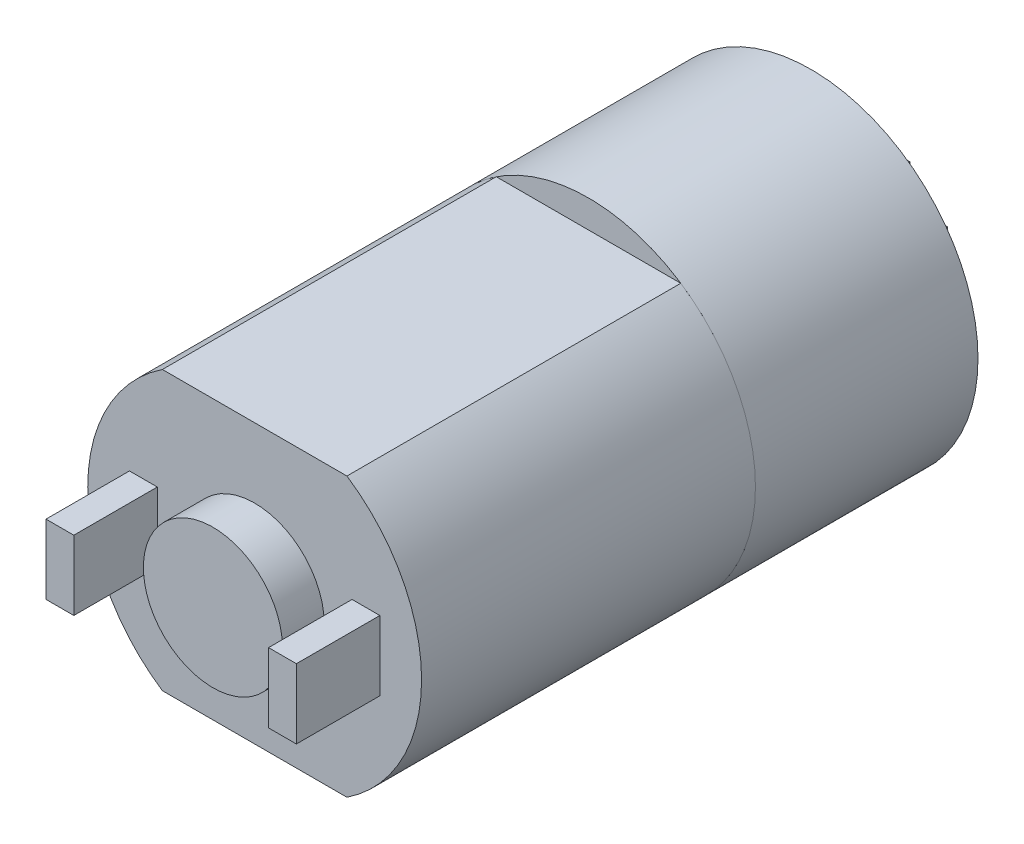
ISO-10303-21;
HEADER;
FILE_DESCRIPTION(('STEP AP214'),'2;1');
FILE_NAME('part.step','',(''),(''),'','','');
FILE_SCHEMA(('AUTOMOTIVE_DESIGN { 1 0 10303 214 1 1 1 1 }'));
ENDSEC;
DATA;
#1=APPLICATION_CONTEXT('core data for automotive mechanical design processes');
#2=APPLICATION_PROTOCOL_DEFINITION('international standard','automotive_design',2000,#1);
#3=PRODUCT_CONTEXT('',#1,'mechanical');
#4=PRODUCT('Part','Part','',(#3));
#5=PRODUCT_RELATED_PRODUCT_CATEGORY('part','',(#4));
#6=PRODUCT_DEFINITION_FORMATION('','',#4);
#7=PRODUCT_DEFINITION_CONTEXT('part definition',#1,'design');
#8=PRODUCT_DEFINITION('design','',#6,#7);
#9=PRODUCT_DEFINITION_SHAPE('','',#8);
#10=(LENGTH_UNIT() NAMED_UNIT(*) SI_UNIT(.MILLI.,.METRE.));
#11=(NAMED_UNIT(*) PLANE_ANGLE_UNIT() SI_UNIT($,.RADIAN.));
#12=(NAMED_UNIT(*) SI_UNIT($,.STERADIAN.) SOLID_ANGLE_UNIT());
#13=UNCERTAINTY_MEASURE_WITH_UNIT(LENGTH_MEASURE(1.E-05),#10,'distance_accuracy_value','');
#14=(GEOMETRIC_REPRESENTATION_CONTEXT(3) GLOBAL_UNCERTAINTY_ASSIGNED_CONTEXT((#13)) GLOBAL_UNIT_ASSIGNED_CONTEXT((#10,
#11,#12)) REPRESENTATION_CONTEXT('',''));
#15=CARTESIAN_POINT('',(0.,0.,0.));
#16=DIRECTION('',(0.,0.,1.));
#17=DIRECTION('',(1.,0.,0.));
#18=AXIS2_PLACEMENT_3D('',#15,#16,#17);
#19=CARTESIAN_POINT('',(4.5,1.25,23.));
#20=DIRECTION('',(-1.,0.,0.));
#21=DIRECTION('',(0.,0.,1.));
#22=AXIS2_PLACEMENT_3D('',#19,#20,#21);
#23=PLANE('',#22);
#24=DIRECTION('',(0.,1.,0.));
#25=VECTOR('',#24,1.);
#26=CARTESIAN_POINT('',(4.5,1.25,20.));
#27=LINE('',#26,#25);
#28=CARTESIAN_POINT('',(4.5,-1.25,20.));
#29=VERTEX_POINT('',#28);
#30=CARTESIAN_POINT('',(4.5,1.25,20.));
#31=VERTEX_POINT('',#30);
#32=EDGE_CURVE('E115',#29,#31,#27,.T.);
#33=ORIENTED_EDGE('',*,*,#32,.T.);
#34=DIRECTION('',(0.,0.,-1.));
#35=VECTOR('',#34,1.);
#36=CARTESIAN_POINT('',(4.5,1.25,23.));
#37=LINE('',#36,#35);
#38=CARTESIAN_POINT('',(4.5,1.25,23.));
#39=VERTEX_POINT('',#38);
#40=EDGE_CURVE('E12',#39,#31,#37,.T.);
#41=ORIENTED_EDGE('',*,*,#40,.F.);
#42=DIRECTION('',(0.,1.,0.));
#43=VECTOR('',#42,1.);
#44=CARTESIAN_POINT('',(4.5,1.25,23.));
#45=LINE('',#44,#43);
#46=CARTESIAN_POINT('',(4.5,-1.25,23.));
#47=VERTEX_POINT('',#46);
#48=EDGE_CURVE('E103',#47,#39,#45,.T.);
#49=ORIENTED_EDGE('',*,*,#48,.F.);
#50=DIRECTION('',(0.,0.,-1.));
#51=VECTOR('',#50,1.);
#52=CARTESIAN_POINT('',(4.5,-1.25,23.));
#53=LINE('',#52,#51);
#54=EDGE_CURVE('E111',#47,#29,#53,.T.);
#55=ORIENTED_EDGE('',*,*,#54,.T.);
#56=EDGE_LOOP('',(#33,#41,#49,#55));
#57=FACE_BOUND('',#56,.T.);
#58=ADVANCED_FACE('F52',(#57),#23,.F.);
#59=CARTESIAN_POINT('',(4.5,1.25,23.));
#60=DIRECTION('',(0.,-1.,0.));
#61=DIRECTION('',(1.,0.,0.));
#62=AXIS2_PLACEMENT_3D('',#59,#60,#61);
#63=PLANE('',#62);
#64=DIRECTION('',(-1.,0.,0.));
#65=VECTOR('',#64,1.);
#66=CARTESIAN_POINT('',(4.5,1.25,20.));
#67=LINE('',#66,#65);
#68=CARTESIAN_POINT('',(3.5,1.25,20.));
#69=VERTEX_POINT('',#68);
#70=EDGE_CURVE('E107',#31,#69,#67,.T.);
#71=ORIENTED_EDGE('',*,*,#70,.T.);
#72=DIRECTION('',(0.,0.,-1.));
#73=VECTOR('',#72,1.);
#74=CARTESIAN_POINT('',(3.5,1.25,23.));
#75=LINE('',#74,#73);
#76=CARTESIAN_POINT('',(3.5,1.25,23.));
#77=VERTEX_POINT('',#76);
#78=EDGE_CURVE('E60',#77,#69,#75,.T.);
#79=ORIENTED_EDGE('',*,*,#78,.F.);
#80=DIRECTION('',(-1.,0.,0.));
#81=VECTOR('',#80,1.);
#82=CARTESIAN_POINT('',(4.5,1.25,23.));
#83=LINE('',#82,#81);
#84=EDGE_CURVE('E98',#39,#77,#83,.T.);
#85=ORIENTED_EDGE('',*,*,#84,.F.);
#86=ORIENTED_EDGE('',*,*,#40,.T.);
#87=EDGE_LOOP('',(#71,#79,#85,#86));
#88=FACE_BOUND('',#87,.T.);
#89=ADVANCED_FACE('F106',(#88),#63,.F.);
#90=CARTESIAN_POINT('',(3.5,1.25,23.));
#91=DIRECTION('',(1.,0.,0.));
#92=DIRECTION('',(0.,1.,0.));
#93=AXIS2_PLACEMENT_3D('',#90,#91,#92);
#94=PLANE('',#93);
#95=DIRECTION('',(0.,-1.,0.));
#96=VECTOR('',#95,1.);
#97=CARTESIAN_POINT('',(3.5,1.25,20.));
#98=LINE('',#97,#96);
#99=CARTESIAN_POINT('',(3.5,-1.25,20.));
#100=VERTEX_POINT('',#99);
#101=EDGE_CURVE('E85',#69,#100,#98,.T.);
#102=ORIENTED_EDGE('',*,*,#101,.T.);
#103=DIRECTION('',(0.,0.,-1.));
#104=VECTOR('',#103,1.);
#105=CARTESIAN_POINT('',(3.5,-1.25,23.));
#106=LINE('',#105,#104);
#107=CARTESIAN_POINT('',(3.5,-1.25,23.));
#108=VERTEX_POINT('',#107);
#109=EDGE_CURVE('E108',#108,#100,#106,.T.);
#110=ORIENTED_EDGE('',*,*,#109,.F.);
#111=DIRECTION('',(0.,-1.,0.));
#112=VECTOR('',#111,1.);
#113=CARTESIAN_POINT('',(3.5,1.25,23.));
#114=LINE('',#113,#112);
#115=EDGE_CURVE('E101',#77,#108,#114,.T.);
#116=ORIENTED_EDGE('',*,*,#115,.F.);
#117=ORIENTED_EDGE('',*,*,#78,.T.);
#118=EDGE_LOOP('',(#102,#110,#116,#117));
#119=FACE_BOUND('',#118,.T.);
#120=ADVANCED_FACE('F109',(#119),#94,.F.);
#121=CARTESIAN_POINT('',(4.5,-1.25,23.));
#122=DIRECTION('',(0.,1.,0.));
#123=DIRECTION('',(0.,0.,1.));
#124=AXIS2_PLACEMENT_3D('',#121,#122,#123);
#125=PLANE('',#124);
#126=DIRECTION('',(1.,0.,0.));
#127=VECTOR('',#126,1.);
#128=CARTESIAN_POINT('',(4.5,-1.25,20.));
#129=LINE('',#128,#127);
#130=EDGE_CURVE('E91',#100,#29,#129,.T.);
#131=ORIENTED_EDGE('',*,*,#130,.T.);
#132=ORIENTED_EDGE('',*,*,#54,.F.);
#133=DIRECTION('',(1.,0.,0.));
#134=VECTOR('',#133,1.);
#135=CARTESIAN_POINT('',(4.5,-1.25,23.));
#136=LINE('',#135,#134);
#137=EDGE_CURVE('E68',#108,#47,#136,.T.);
#138=ORIENTED_EDGE('',*,*,#137,.F.);
#139=ORIENTED_EDGE('',*,*,#109,.T.);
#140=EDGE_LOOP('',(#131,#132,#138,#139));
#141=FACE_BOUND('',#140,.T.);
#142=ADVANCED_FACE('F122',(#141),#125,.F.);
#143=CARTESIAN_POINT('',(0.,0.,23.));
#144=DIRECTION('',(0.,0.,-1.));
#145=DIRECTION('',(-1.,0.,0.));
#146=AXIS2_PLACEMENT_3D('',#143,#144,#145);
#147=PLANE('',#146);
#148=ORIENTED_EDGE('',*,*,#48,.T.);
#149=ORIENTED_EDGE('',*,*,#84,.T.);
#150=ORIENTED_EDGE('',*,*,#115,.T.);
#151=ORIENTED_EDGE('',*,*,#137,.T.);
#152=EDGE_LOOP('',(#148,#149,#150,#151));
#153=FACE_BOUND('',#152,.T.);
#154=ADVANCED_FACE('F99',(#153),#147,.F.);
#155=CARTESIAN_POINT('',(0.,0.,20.));
#156=DIRECTION('',(0.,0.,-1.));
#157=DIRECTION('',(-1.,0.,0.));
#158=AXIS2_PLACEMENT_3D('',#155,#156,#157);
#159=PLANE('',#158);
#160=ORIENTED_EDGE('',*,*,#32,.F.);
#161=ORIENTED_EDGE('',*,*,#130,.F.);
#162=ORIENTED_EDGE('',*,*,#101,.F.);
#163=ORIENTED_EDGE('',*,*,#70,.F.);
#164=EDGE_LOOP('',(#160,#161,#162,#163));
#165=FACE_BOUND('',#164,.T.);
#166=ADVANCED_FACE('F125',(#165),#159,.T.);
#167=CLOSED_SHELL('',(#58,#89,#120,#142,#154,#166));
#168=MANIFOLD_SOLID_BREP('B2',#167);
#169=CARTESIAN_POINT('',(-3.5,1.25,23.));
#170=DIRECTION('',(-1.,0.,0.));
#171=DIRECTION('',(0.,-1.,0.));
#172=AXIS2_PLACEMENT_3D('',#169,#170,#171);
#173=PLANE('',#172);
#174=DIRECTION('',(0.,1.,0.));
#175=VECTOR('',#174,1.);
#176=CARTESIAN_POINT('',(-3.5,1.25,20.));
#177=LINE('',#176,#175);
#178=CARTESIAN_POINT('',(-3.5,-1.25,20.));
#179=VERTEX_POINT('',#178);
#180=CARTESIAN_POINT('',(-3.5,1.25,20.));
#181=VERTEX_POINT('',#180);
#182=EDGE_CURVE('E237',#179,#181,#177,.T.);
#183=ORIENTED_EDGE('',*,*,#182,.T.);
#184=DIRECTION('',(0.,0.,-1.));
#185=VECTOR('',#184,1.);
#186=CARTESIAN_POINT('',(-3.5,1.25,23.));
#187=LINE('',#186,#185);
#188=CARTESIAN_POINT('',(-3.5,1.25,23.));
#189=VERTEX_POINT('',#188);
#190=EDGE_CURVE('E50',#189,#181,#187,.T.);
#191=ORIENTED_EDGE('',*,*,#190,.F.);
#192=DIRECTION('',(0.,1.,0.));
#193=VECTOR('',#192,1.);
#194=CARTESIAN_POINT('',(-3.5,1.25,23.));
#195=LINE('',#194,#193);
#196=CARTESIAN_POINT('',(-3.5,-1.25,23.));
#197=VERTEX_POINT('',#196);
#198=EDGE_CURVE('E225',#197,#189,#195,.T.);
#199=ORIENTED_EDGE('',*,*,#198,.F.);
#200=DIRECTION('',(0.,0.,-1.));
#201=VECTOR('',#200,1.);
#202=CARTESIAN_POINT('',(-3.5,-1.25,23.));
#203=LINE('',#202,#201);
#204=EDGE_CURVE('E233',#197,#179,#203,.T.);
#205=ORIENTED_EDGE('',*,*,#204,.T.);
#206=EDGE_LOOP('',(#183,#191,#199,#205));
#207=FACE_BOUND('',#206,.T.);
#208=ADVANCED_FACE('F174',(#207),#173,.F.);
#209=CARTESIAN_POINT('',(-4.5,1.25,23.));
#210=DIRECTION('',(0.,-1.,0.));
#211=DIRECTION('',(1.,0.,0.));
#212=AXIS2_PLACEMENT_3D('',#209,#210,#211);
#213=PLANE('',#212);
#214=DIRECTION('',(-1.,0.,0.));
#215=VECTOR('',#214,1.);
#216=CARTESIAN_POINT('',(-4.5,1.25,20.));
#217=LINE('',#216,#215);
#218=CARTESIAN_POINT('',(-4.5,1.25,20.));
#219=VERTEX_POINT('',#218);
#220=EDGE_CURVE('E229',#181,#219,#217,.T.);
#221=ORIENTED_EDGE('',*,*,#220,.T.);
#222=DIRECTION('',(0.,0.,-1.));
#223=VECTOR('',#222,1.);
#224=CARTESIAN_POINT('',(-4.5,1.25,23.));
#225=LINE('',#224,#223);
#226=CARTESIAN_POINT('',(-4.5,1.25,23.));
#227=VERTEX_POINT('',#226);
#228=EDGE_CURVE('E182',#227,#219,#225,.T.);
#229=ORIENTED_EDGE('',*,*,#228,.F.);
#230=DIRECTION('',(-1.,0.,0.));
#231=VECTOR('',#230,1.);
#232=CARTESIAN_POINT('',(-4.5,1.25,23.));
#233=LINE('',#232,#231);
#234=EDGE_CURVE('E220',#189,#227,#233,.T.);
#235=ORIENTED_EDGE('',*,*,#234,.F.);
#236=ORIENTED_EDGE('',*,*,#190,.T.);
#237=EDGE_LOOP('',(#221,#229,#235,#236));
#238=FACE_BOUND('',#237,.T.);
#239=ADVANCED_FACE('F228',(#238),#213,.F.);
#240=CARTESIAN_POINT('',(-4.5,1.25,23.));
#241=DIRECTION('',(1.,0.,0.));
#242=DIRECTION('',(0.,0.,-1.));
#243=AXIS2_PLACEMENT_3D('',#240,#241,#242);
#244=PLANE('',#243);
#245=DIRECTION('',(0.,-1.,0.));
#246=VECTOR('',#245,1.);
#247=CARTESIAN_POINT('',(-4.5,1.25,20.));
#248=LINE('',#247,#246);
#249=CARTESIAN_POINT('',(-4.5,-1.25,20.));
#250=VERTEX_POINT('',#249);
#251=EDGE_CURVE('E207',#219,#250,#248,.T.);
#252=ORIENTED_EDGE('',*,*,#251,.T.);
#253=DIRECTION('',(0.,0.,-1.));
#254=VECTOR('',#253,1.);
#255=CARTESIAN_POINT('',(-4.5,-1.25,23.));
#256=LINE('',#255,#254);
#257=CARTESIAN_POINT('',(-4.5,-1.25,23.));
#258=VERTEX_POINT('',#257);
#259=EDGE_CURVE('E230',#258,#250,#256,.T.);
#260=ORIENTED_EDGE('',*,*,#259,.F.);
#261=DIRECTION('',(0.,-1.,0.));
#262=VECTOR('',#261,1.);
#263=CARTESIAN_POINT('',(-4.5,1.25,23.));
#264=LINE('',#263,#262);
#265=EDGE_CURVE('E223',#227,#258,#264,.T.);
#266=ORIENTED_EDGE('',*,*,#265,.F.);
#267=ORIENTED_EDGE('',*,*,#228,.T.);
#268=EDGE_LOOP('',(#252,#260,#266,#267));
#269=FACE_BOUND('',#268,.T.);
#270=ADVANCED_FACE('F231',(#269),#244,.F.);
#271=CARTESIAN_POINT('',(-4.5,-1.25,23.));
#272=DIRECTION('',(0.,1.,0.));
#273=DIRECTION('',(0.,0.,1.));
#274=AXIS2_PLACEMENT_3D('',#271,#272,#273);
#275=PLANE('',#274);
#276=DIRECTION('',(1.,0.,0.));
#277=VECTOR('',#276,1.);
#278=CARTESIAN_POINT('',(-4.5,-1.25,20.));
#279=LINE('',#278,#277);
#280=EDGE_CURVE('E213',#250,#179,#279,.T.);
#281=ORIENTED_EDGE('',*,*,#280,.T.);
#282=ORIENTED_EDGE('',*,*,#204,.F.);
#283=DIRECTION('',(1.,0.,0.));
#284=VECTOR('',#283,1.);
#285=CARTESIAN_POINT('',(-4.5,-1.25,23.));
#286=LINE('',#285,#284);
#287=EDGE_CURVE('E190',#258,#197,#286,.T.);
#288=ORIENTED_EDGE('',*,*,#287,.F.);
#289=ORIENTED_EDGE('',*,*,#259,.T.);
#290=EDGE_LOOP('',(#281,#282,#288,#289));
#291=FACE_BOUND('',#290,.T.);
#292=ADVANCED_FACE('F244',(#291),#275,.F.);
#293=CARTESIAN_POINT('',(0.,0.,23.));
#294=DIRECTION('',(0.,0.,1.));
#295=DIRECTION('',(1.,0.,0.));
#296=AXIS2_PLACEMENT_3D('',#293,#294,#295);
#297=PLANE('',#296);
#298=ORIENTED_EDGE('',*,*,#198,.T.);
#299=ORIENTED_EDGE('',*,*,#234,.T.);
#300=ORIENTED_EDGE('',*,*,#265,.T.);
#301=ORIENTED_EDGE('',*,*,#287,.T.);
#302=EDGE_LOOP('',(#298,#299,#300,#301));
#303=FACE_BOUND('',#302,.T.);
#304=ADVANCED_FACE('F221',(#303),#297,.T.);
#305=CARTESIAN_POINT('',(0.,0.,20.));
#306=DIRECTION('',(0.,0.,1.));
#307=DIRECTION('',(1.,0.,0.));
#308=AXIS2_PLACEMENT_3D('',#305,#306,#307);
#309=PLANE('',#308);
#310=ORIENTED_EDGE('',*,*,#182,.F.);
#311=ORIENTED_EDGE('',*,*,#280,.F.);
#312=ORIENTED_EDGE('',*,*,#251,.F.);
#313=ORIENTED_EDGE('',*,*,#220,.F.);
#314=EDGE_LOOP('',(#310,#311,#312,#313));
#315=FACE_BOUND('',#314,.T.);
#316=ADVANCED_FACE('F247',(#315),#309,.F.);
#317=CLOSED_SHELL('',(#208,#239,#270,#292,#304,#316));
#318=MANIFOLD_SOLID_BREP('B6',#317);
#319=CARTESIAN_POINT('',(0.,0.,20.));
#320=DIRECTION('',(0.,0.,-1.));
#321=DIRECTION('',(-1.,0.,0.));
#322=AXIS2_PLACEMENT_3D('',#319,#320,#321);
#323=CYLINDRICAL_SURFACE('',#322,6.);
#324=CARTESIAN_POINT('',(0.,0.,8.));
#325=DIRECTION('',(0.,0.,1.));
#326=DIRECTION('',(-1.,0.,0.));
#327=AXIS2_PLACEMENT_3D('',#324,#325,#326);
#328=CIRCLE('',#327,6.);
#329=CARTESIAN_POINT('',(-3.3166247903554,5.,8.));
#330=VERTEX_POINT('',#329);
#331=CARTESIAN_POINT('',(-3.31662479035532,-5.00000000000006,8.));
#332=VERTEX_POINT('',#331);
#333=EDGE_CURVE('E361',#330,#332,#328,.T.);
#334=ORIENTED_EDGE('',*,*,#333,.T.);
#335=DIRECTION('',(0.,0.,-1.));
#336=VECTOR('',#335,1.);
#337=CARTESIAN_POINT('',(-3.31662479035532,-5.00000000000006,20.));
#338=LINE('',#337,#336);
#339=CARTESIAN_POINT('',(-3.31662479035532,-5.00000000000006,20.));
#340=VERTEX_POINT('',#339);
#341=EDGE_CURVE('E298',#340,#332,#338,.T.);
#342=ORIENTED_EDGE('',*,*,#341,.F.);
#343=CARTESIAN_POINT('',(0.,0.,20.));
#344=DIRECTION('',(0.,0.,1.));
#345=DIRECTION('',(-1.,0.,0.));
#346=AXIS2_PLACEMENT_3D('',#343,#344,#345);
#347=CIRCLE('',#346,6.);
#348=CARTESIAN_POINT('',(-3.3166247903554,5.,20.));
#349=VERTEX_POINT('',#348);
#350=EDGE_CURVE('E348',#349,#340,#347,.T.);
#351=ORIENTED_EDGE('',*,*,#350,.F.);
#352=DIRECTION('',(0.,0.,-1.));
#353=VECTOR('',#352,1.);
#354=CARTESIAN_POINT('',(-3.3166247903554,5.,20.));
#355=LINE('',#354,#353);
#356=EDGE_CURVE('E357',#349,#330,#355,.T.);
#357=ORIENTED_EDGE('',*,*,#356,.T.);
#358=EDGE_LOOP('',(#334,#342,#351,#357));
#359=FACE_BOUND('',#358,.T.);
#360=ADVANCED_FACE('F295',(#359),#323,.T.);
#361=CARTESIAN_POINT('',(3.31662479035532,-5.00000000000006,20.));
#362=DIRECTION('',(0.,1.,0.));
#363=DIRECTION('',(0.,0.,1.));
#364=AXIS2_PLACEMENT_3D('',#361,#362,#363);
#365=PLANE('',#364);
#366=DIRECTION('',(1.,0.,0.));
#367=VECTOR('',#366,1.);
#368=CARTESIAN_POINT('',(3.31662479035532,-5.00000000000006,8.));
#369=LINE('',#368,#367);
#370=CARTESIAN_POINT('',(3.31662479035532,-5.00000000000006,8.));
#371=VERTEX_POINT('',#370);
#372=EDGE_CURVE('E353',#332,#371,#369,.T.);
#373=ORIENTED_EDGE('',*,*,#372,.T.);
#374=DIRECTION('',(0.,0.,-1.));
#375=VECTOR('',#374,1.);
#376=CARTESIAN_POINT('',(3.31662479035532,-5.00000000000006,20.));
#377=LINE('',#376,#375);
#378=CARTESIAN_POINT('',(3.31662479035532,-5.00000000000006,20.));
#379=VERTEX_POINT('',#378);
#380=EDGE_CURVE('E351',#379,#371,#377,.T.);
#381=ORIENTED_EDGE('',*,*,#380,.F.);
#382=DIRECTION('',(1.,0.,0.));
#383=VECTOR('',#382,1.);
#384=CARTESIAN_POINT('',(3.31662479035532,-5.00000000000006,20.));
#385=LINE('',#384,#383);
#386=EDGE_CURVE('E343',#340,#379,#385,.T.);
#387=ORIENTED_EDGE('',*,*,#386,.F.);
#388=ORIENTED_EDGE('',*,*,#341,.T.);
#389=EDGE_LOOP('',(#373,#381,#387,#388));
#390=FACE_BOUND('',#389,.T.);
#391=ADVANCED_FACE('F352',(#390),#365,.F.);
#392=CARTESIAN_POINT('',(0.,0.,20.));
#393=DIRECTION('',(0.,0.,-1.));
#394=DIRECTION('',(-1.,0.,0.));
#395=AXIS2_PLACEMENT_3D('',#392,#393,#394);
#396=CYLINDRICAL_SURFACE('',#395,6.);
#397=CARTESIAN_POINT('',(0.,0.,8.));
#398=DIRECTION('',(0.,0.,1.));
#399=DIRECTION('',(-1.,0.,0.));
#400=AXIS2_PLACEMENT_3D('',#397,#398,#399);
#401=CIRCLE('',#400,6.);
#402=CARTESIAN_POINT('',(3.3166247903554,5.,8.));
#403=VERTEX_POINT('',#402);
#404=EDGE_CURVE('E329',#371,#403,#401,.T.);
#405=ORIENTED_EDGE('',*,*,#404,.T.);
#406=DIRECTION('',(0.,0.,-1.));
#407=VECTOR('',#406,1.);
#408=CARTESIAN_POINT('',(3.3166247903554,5.,20.));
#409=LINE('',#408,#407);
#410=CARTESIAN_POINT('',(3.3166247903554,5.,20.));
#411=VERTEX_POINT('',#410);
#412=EDGE_CURVE('E354',#411,#403,#409,.T.);
#413=ORIENTED_EDGE('',*,*,#412,.F.);
#414=CARTESIAN_POINT('',(0.,0.,20.));
#415=DIRECTION('',(0.,0.,1.));
#416=DIRECTION('',(-1.,0.,0.));
#417=AXIS2_PLACEMENT_3D('',#414,#415,#416);
#418=CIRCLE('',#417,6.);
#419=EDGE_CURVE('E346',#379,#411,#418,.T.);
#420=ORIENTED_EDGE('',*,*,#419,.F.);
#421=ORIENTED_EDGE('',*,*,#380,.T.);
#422=EDGE_LOOP('',(#405,#413,#420,#421));
#423=FACE_BOUND('',#422,.T.);
#424=ADVANCED_FACE('F355',(#423),#396,.T.);
#425=CARTESIAN_POINT('',(3.3166247903554,5.,20.));
#426=DIRECTION('',(0.,-1.,0.));
#427=DIRECTION('',(1.,0.,0.));
#428=AXIS2_PLACEMENT_3D('',#425,#426,#427);
#429=PLANE('',#428);
#430=DIRECTION('',(-1.,0.,0.));
#431=VECTOR('',#430,1.);
#432=CARTESIAN_POINT('',(3.3166247903554,5.,8.));
#433=LINE('',#432,#431);
#434=EDGE_CURVE('E335',#403,#330,#433,.T.);
#435=ORIENTED_EDGE('',*,*,#434,.T.);
#436=ORIENTED_EDGE('',*,*,#356,.F.);
#437=DIRECTION('',(-1.,0.,0.));
#438=VECTOR('',#437,1.);
#439=CARTESIAN_POINT('',(3.3166247903554,5.,20.));
#440=LINE('',#439,#438);
#441=EDGE_CURVE('E312',#411,#349,#440,.T.);
#442=ORIENTED_EDGE('',*,*,#441,.F.);
#443=ORIENTED_EDGE('',*,*,#412,.T.);
#444=EDGE_LOOP('',(#435,#436,#442,#443));
#445=FACE_BOUND('',#444,.T.);
#446=ADVANCED_FACE('F369',(#445),#429,.F.);
#447=CARTESIAN_POINT('',(0.,0.,20.));
#448=DIRECTION('',(0.,0.,-1.));
#449=DIRECTION('',(-1.,0.,0.));
#450=AXIS2_PLACEMENT_3D('',#447,#448,#449);
#451=PLANE('',#450);
#452=CARTESIAN_POINT('',(0.,0.,20.));
#453=DIRECTION('',(0.,0.,1.));
#454=DIRECTION('',(1.,0.,0.));
#455=AXIS2_PLACEMENT_3D('',#452,#453,#454);
#456=CIRCLE('',#455,2.5);
#457=CARTESIAN_POINT('',(2.5,0.,20.));
#458=VERTEX_POINT('',#457);
#459=EDGE_CURVE('E172',#458,#458,#456,.T.);
#460=ORIENTED_EDGE('',*,*,#459,.F.);
#461=EDGE_LOOP('',(#460));
#462=FACE_BOUND('',#461,.T.);
#463=ORIENTED_EDGE('',*,*,#350,.T.);
#464=ORIENTED_EDGE('',*,*,#386,.T.);
#465=ORIENTED_EDGE('',*,*,#419,.T.);
#466=ORIENTED_EDGE('',*,*,#441,.T.);
#467=EDGE_LOOP('',(#463,#464,#465,#466));
#468=FACE_BOUND('',#467,.T.);
#469=ADVANCED_FACE('F344',(#462,#468),#451,.F.);
#470=CARTESIAN_POINT('',(0.,0.,8.));
#471=DIRECTION('',(0.,0.,-1.));
#472=DIRECTION('',(-1.,0.,0.));
#473=AXIS2_PLACEMENT_3D('',#470,#471,#472);
#474=PLANE('',#473);
#475=ORIENTED_EDGE('',*,*,#333,.F.);
#476=ORIENTED_EDGE('',*,*,#434,.F.);
#477=ORIENTED_EDGE('',*,*,#404,.F.);
#478=ORIENTED_EDGE('',*,*,#372,.F.);
#479=EDGE_LOOP('',(#475,#476,#477,#478));
#480=FACE_BOUND('',#479,.T.);
#481=ADVANCED_FACE('F372',(#480),#474,.T.);
#482=CARTESIAN_POINT('',(0.,0.,21.5));
#483=DIRECTION('',(0.,0.,-1.));
#484=DIRECTION('',(-1.,0.,0.));
#485=AXIS2_PLACEMENT_3D('',#482,#483,#484);
#486=CYLINDRICAL_SURFACE('',#485,2.5);
#487=CARTESIAN_POINT('',(0.,0.,21.5));
#488=DIRECTION('',(0.,0.,1.));
#489=DIRECTION('',(1.,0.,0.));
#490=AXIS2_PLACEMENT_3D('',#487,#488,#489);
#491=CIRCLE('',#490,2.5);
#492=CARTESIAN_POINT('',(2.5,0.,21.5));
#493=VERTEX_POINT('',#492);
#494=EDGE_CURVE('E364',#493,#493,#491,.T.);
#495=ORIENTED_EDGE('',*,*,#494,.F.);
#496=EDGE_LOOP('',(#495));
#497=FACE_BOUND('',#496,.T.);
#498=ORIENTED_EDGE('',*,*,#459,.T.);
#499=EDGE_LOOP('',(#498));
#500=FACE_BOUND('',#499,.T.);
#501=ADVANCED_FACE('F380',(#497,#500),#486,.T.);
#502=CARTESIAN_POINT('',(0.,0.,21.5));
#503=DIRECTION('',(0.,0.,1.));
#504=DIRECTION('',(1.,0.,0.));
#505=AXIS2_PLACEMENT_3D('',#502,#503,#504);
#506=PLANE('',#505);
#507=ORIENTED_EDGE('',*,*,#494,.T.);
#508=EDGE_LOOP('',(#507));
#509=FACE_BOUND('',#508,.T.);
#510=ADVANCED_FACE('F378',(#509),#506,.T.);
#511=CLOSED_SHELL('',(#360,#391,#424,#446,#469,#481,#501,#510));
#512=MANIFOLD_SOLID_BREP('B44',#511);
#513=CARTESIAN_POINT('',(0.,0.,0.));
#514=DIRECTION('',(0.,0.,1.));
#515=DIRECTION('',(1.,0.,0.));
#516=AXIS2_PLACEMENT_3D('',#513,#514,#515);
#517=PLANE('',#516);
#518=CARTESIAN_POINT('',(0.,0.,0.));
#519=DIRECTION('',(0.,0.,1.));
#520=DIRECTION('',(1.,0.,0.));
#521=AXIS2_PLACEMENT_3D('',#518,#519,#520);
#522=CIRCLE('',#521,6.);
#523=CARTESIAN_POINT('',(6.,0.,0.));
#524=VERTEX_POINT('',#523);
#525=EDGE_CURVE('E437',#524,#524,#522,.T.);
#526=ORIENTED_EDGE('',*,*,#525,.F.);
#527=EDGE_LOOP('',(#526));
#528=FACE_BOUND('',#527,.T.);
#529=DIRECTION('',(-1.,0.,0.));
#530=VECTOR('',#529,1.);
#531=CARTESIAN_POINT('',(-0.85,-2.2,0.));
#532=LINE('',#531,#530);
#533=CARTESIAN_POINT('',(0.85,-2.2,0.));
#534=VERTEX_POINT('',#533);
#535=CARTESIAN_POINT('',(-0.85,-2.2,0.));
#536=VERTEX_POINT('',#535);
#537=EDGE_CURVE('E450',#534,#536,#532,.T.);
#538=ORIENTED_EDGE('',*,*,#537,.F.);
#539=DIRECTION('',(0.,-1.,0.));
#540=VECTOR('',#539,1.);
#541=CARTESIAN_POINT('',(0.85,-2.2,0.));
#542=LINE('',#541,#540);
#543=CARTESIAN_POINT('',(0.85,-0.85,0.));
#544=VERTEX_POINT('',#543);
#545=EDGE_CURVE('E454',#544,#534,#542,.T.);
#546=ORIENTED_EDGE('',*,*,#545,.F.);
#547=DIRECTION('',(-1.,0.,0.));
#548=VECTOR('',#547,1.);
#549=CARTESIAN_POINT('',(0.85,-0.85,0.));
#550=LINE('',#549,#548);
#551=CARTESIAN_POINT('',(2.2,-0.85,0.));
#552=VERTEX_POINT('',#551);
#553=EDGE_CURVE('E671',#552,#544,#550,.T.);
#554=ORIENTED_EDGE('',*,*,#553,.F.);
#555=DIRECTION('',(0.,-1.,0.));
#556=VECTOR('',#555,1.);
#557=CARTESIAN_POINT('',(2.2,-0.85,0.));
#558=LINE('',#557,#556);
#559=CARTESIAN_POINT('',(2.2,0.85,0.));
#560=VERTEX_POINT('',#559);
#561=EDGE_CURVE('E668',#560,#552,#558,.T.);
#562=ORIENTED_EDGE('',*,*,#561,.F.);
#563=DIRECTION('',(1.,0.,0.));
#564=VECTOR('',#563,1.);
#565=CARTESIAN_POINT('',(2.2,0.85,0.));
#566=LINE('',#565,#564);
#567=CARTESIAN_POINT('',(0.85,0.85,0.));
#568=VERTEX_POINT('',#567);
#569=EDGE_CURVE('E665',#568,#560,#566,.T.);
#570=ORIENTED_EDGE('',*,*,#569,.F.);
#571=DIRECTION('',(0.,-1.,0.));
#572=VECTOR('',#571,1.);
#573=CARTESIAN_POINT('',(0.85,0.85,0.));
#574=LINE('',#573,#572);
#575=CARTESIAN_POINT('',(0.85,2.2,0.));
#576=VERTEX_POINT('',#575);
#577=EDGE_CURVE('E662',#576,#568,#574,.T.);
#578=ORIENTED_EDGE('',*,*,#577,.F.);
#579=DIRECTION('',(1.,0.,0.));
#580=VECTOR('',#579,1.);
#581=CARTESIAN_POINT('',(0.85,2.2,0.));
#582=LINE('',#581,#580);
#583=CARTESIAN_POINT('',(-0.85,2.2,0.));
#584=VERTEX_POINT('',#583);
#585=EDGE_CURVE('E659',#584,#576,#582,.T.);
#586=ORIENTED_EDGE('',*,*,#585,.F.);
#587=DIRECTION('',(0.,1.,0.));
#588=VECTOR('',#587,1.);
#589=CARTESIAN_POINT('',(-0.85,2.2,0.));
#590=LINE('',#589,#588);
#591=CARTESIAN_POINT('',(-0.85,0.85,0.));
#592=VERTEX_POINT('',#591);
#593=EDGE_CURVE('E656',#592,#584,#590,.T.);
#594=ORIENTED_EDGE('',*,*,#593,.F.);
#595=DIRECTION('',(1.,0.,0.));
#596=VECTOR('',#595,1.);
#597=CARTESIAN_POINT('',(-0.85,0.85,0.));
#598=LINE('',#597,#596);
#599=CARTESIAN_POINT('',(-2.2,0.85,0.));
#600=VERTEX_POINT('',#599);
#601=EDGE_CURVE('E653',#600,#592,#598,.T.);
#602=ORIENTED_EDGE('',*,*,#601,.F.);
#603=DIRECTION('',(0.,1.,0.));
#604=VECTOR('',#603,1.);
#605=CARTESIAN_POINT('',(-2.2,0.85,0.));
#606=LINE('',#605,#604);
#607=CARTESIAN_POINT('',(-2.2,-0.85,0.));
#608=VERTEX_POINT('',#607);
#609=EDGE_CURVE('E650',#608,#600,#606,.T.);
#610=ORIENTED_EDGE('',*,*,#609,.F.);
#611=DIRECTION('',(-1.,0.,0.));
#612=VECTOR('',#611,1.);
#613=CARTESIAN_POINT('',(-2.2,-0.85,0.));
#614=LINE('',#613,#612);
#615=CARTESIAN_POINT('',(-0.85,-0.85,0.));
#616=VERTEX_POINT('',#615);
#617=EDGE_CURVE('E647',#616,#608,#614,.T.);
#618=ORIENTED_EDGE('',*,*,#617,.F.);
#619=DIRECTION('',(0.,1.,0.));
#620=VECTOR('',#619,1.);
#621=CARTESIAN_POINT('',(-0.85,-0.85,0.));
#622=LINE('',#621,#620);
#623=EDGE_CURVE('E624',#536,#616,#622,.T.);
#624=ORIENTED_EDGE('',*,*,#623,.F.);
#625=EDGE_LOOP('',(#538,#546,#554,#562,#570,#578,#586,#594,#602,#610,#618,#624));
#626=FACE_BOUND('',#625,.T.);
#627=ADVANCED_FACE('F433',(#528,#626),#517,.F.);
#628=CARTESIAN_POINT('',(0.,0.,8.));
#629=DIRECTION('',(0.,0.,-1.));
#630=DIRECTION('',(-1.,0.,0.));
#631=AXIS2_PLACEMENT_3D('',#628,#629,#630);
#632=CYLINDRICAL_SURFACE('',#631,6.);
#633=CARTESIAN_POINT('',(0.,0.,8.));
#634=DIRECTION('',(0.,0.,1.));
#635=DIRECTION('',(1.,0.,0.));
#636=AXIS2_PLACEMENT_3D('',#633,#634,#635);
#637=CIRCLE('',#636,6.);
#638=CARTESIAN_POINT('',(6.,0.,8.));
#639=VERTEX_POINT('',#638);
#640=EDGE_CURVE('E442',#639,#639,#637,.T.);
#641=ORIENTED_EDGE('',*,*,#640,.F.);
#642=EDGE_LOOP('',(#641));
#643=FACE_BOUND('',#642,.T.);
#644=ORIENTED_EDGE('',*,*,#525,.T.);
#645=EDGE_LOOP('',(#644));
#646=FACE_BOUND('',#645,.T.);
#647=ADVANCED_FACE('F435',(#643,#646),#632,.T.);
#648=CARTESIAN_POINT('',(0.,0.,8.));
#649=DIRECTION('',(0.,0.,1.));
#650=DIRECTION('',(1.,0.,0.));
#651=AXIS2_PLACEMENT_3D('',#648,#649,#650);
#652=PLANE('',#651);
#653=ORIENTED_EDGE('',*,*,#640,.T.);
#654=EDGE_LOOP('',(#653));
#655=FACE_BOUND('',#654,.T.);
#656=ADVANCED_FACE('F552',(#655),#652,.T.);
#657=CARTESIAN_POINT('',(-0.85,-2.2,-2.7));
#658=DIRECTION('',(0.,1.,0.));
#659=DIRECTION('',(0.,0.,1.));
#660=AXIS2_PLACEMENT_3D('',#657,#658,#659);
#661=PLANE('',#660);
#662=ORIENTED_EDGE('',*,*,#537,.T.);
#663=DIRECTION('',(0.,0.,1.));
#664=VECTOR('',#663,1.);
#665=CARTESIAN_POINT('',(-0.85,-2.2,-2.7));
#666=LINE('',#665,#664);
#667=CARTESIAN_POINT('',(-0.85,-2.2,-2.7));
#668=VERTEX_POINT('',#667);
#669=EDGE_CURVE('E527',#668,#536,#666,.T.);
#670=ORIENTED_EDGE('',*,*,#669,.F.);
#671=DIRECTION('',(-1.,0.,0.));
#672=VECTOR('',#671,1.);
#673=CARTESIAN_POINT('',(-0.85,-2.2,-2.7));
#674=LINE('',#673,#672);
#675=CARTESIAN_POINT('',(0.85,-2.2,-2.7));
#676=VERTEX_POINT('',#675);
#677=EDGE_CURVE('E533',#676,#668,#674,.T.);
#678=ORIENTED_EDGE('',*,*,#677,.F.);
#679=DIRECTION('',(0.,0.,1.));
#680=VECTOR('',#679,1.);
#681=CARTESIAN_POINT('',(0.85,-2.2,-2.7));
#682=LINE('',#681,#680);
#683=EDGE_CURVE('E644',#676,#534,#682,.T.);
#684=ORIENTED_EDGE('',*,*,#683,.T.);
#685=EDGE_LOOP('',(#662,#670,#678,#684));
#686=FACE_BOUND('',#685,.T.);
#687=ADVANCED_FACE('F543',(#686),#661,.F.);
#688=CARTESIAN_POINT('',(-0.85,-0.85,-2.7));
#689=DIRECTION('',(1.,0.,0.));
#690=DIRECTION('',(0.,1.,0.));
#691=AXIS2_PLACEMENT_3D('',#688,#689,#690);
#692=PLANE('',#691);
#693=ORIENTED_EDGE('',*,*,#623,.T.);
#694=DIRECTION('',(0.,0.,1.));
#695=VECTOR('',#694,1.);
#696=CARTESIAN_POINT('',(-0.85,-0.85,-2.7));
#697=LINE('',#696,#695);
#698=CARTESIAN_POINT('',(-0.85,-0.85,-2.7));
#699=VERTEX_POINT('',#698);
#700=EDGE_CURVE('E529',#699,#616,#697,.T.);
#701=ORIENTED_EDGE('',*,*,#700,.F.);
#702=DIRECTION('',(0.,1.,0.));
#703=VECTOR('',#702,1.);
#704=CARTESIAN_POINT('',(-0.85,-0.85,-2.7));
#705=LINE('',#704,#703);
#706=EDGE_CURVE('E522',#668,#699,#705,.T.);
#707=ORIENTED_EDGE('',*,*,#706,.F.);
#708=ORIENTED_EDGE('',*,*,#669,.T.);
#709=EDGE_LOOP('',(#693,#701,#707,#708));
#710=FACE_BOUND('',#709,.T.);
#711=ADVANCED_FACE('F525',(#710),#692,.F.);
#712=CARTESIAN_POINT('',(-2.2,-0.85,-2.7));
#713=DIRECTION('',(0.,1.,0.));
#714=DIRECTION('',(-1.,0.,0.));
#715=AXIS2_PLACEMENT_3D('',#712,#713,#714);
#716=PLANE('',#715);
#717=ORIENTED_EDGE('',*,*,#617,.T.);
#718=DIRECTION('',(0.,0.,1.));
#719=VECTOR('',#718,1.);
#720=CARTESIAN_POINT('',(-2.2,-0.85,-2.7));
#721=LINE('',#720,#719);
#722=CARTESIAN_POINT('',(-2.2,-0.85,-2.7));
#723=VERTEX_POINT('',#722);
#724=EDGE_CURVE('E546',#723,#608,#721,.T.);
#725=ORIENTED_EDGE('',*,*,#724,.F.);
#726=DIRECTION('',(-1.,0.,0.));
#727=VECTOR('',#726,1.);
#728=CARTESIAN_POINT('',(-2.2,-0.85,-2.7));
#729=LINE('',#728,#727);
#730=EDGE_CURVE('E532',#699,#723,#729,.T.);
#731=ORIENTED_EDGE('',*,*,#730,.F.);
#732=ORIENTED_EDGE('',*,*,#700,.T.);
#733=EDGE_LOOP('',(#717,#725,#731,#732));
#734=FACE_BOUND('',#733,.T.);
#735=ADVANCED_FACE('F568',(#734),#716,.F.);
#736=CARTESIAN_POINT('',(-2.2,0.85,-2.7));
#737=DIRECTION('',(1.,0.,0.));
#738=DIRECTION('',(0.,0.,-1.));
#739=AXIS2_PLACEMENT_3D('',#736,#737,#738);
#740=PLANE('',#739);
#741=ORIENTED_EDGE('',*,*,#609,.T.);
#742=DIRECTION('',(0.,0.,1.));
#743=VECTOR('',#742,1.);
#744=CARTESIAN_POINT('',(-2.2,0.85,-2.7));
#745=LINE('',#744,#743);
#746=CARTESIAN_POINT('',(-2.2,0.85,-2.7));
#747=VERTEX_POINT('',#746);
#748=EDGE_CURVE('E696',#747,#600,#745,.T.);
#749=ORIENTED_EDGE('',*,*,#748,.F.);
#750=DIRECTION('',(0.,1.,0.));
#751=VECTOR('',#750,1.);
#752=CARTESIAN_POINT('',(-2.2,0.85,-2.7));
#753=LINE('',#752,#751);
#754=EDGE_CURVE('E628',#723,#747,#753,.T.);
#755=ORIENTED_EDGE('',*,*,#754,.F.);
#756=ORIENTED_EDGE('',*,*,#724,.T.);
#757=EDGE_LOOP('',(#741,#749,#755,#756));
#758=FACE_BOUND('',#757,.T.);
#759=ADVANCED_FACE('F571',(#758),#740,.F.);
#760=CARTESIAN_POINT('',(-0.85,0.85,-2.7));
#761=DIRECTION('',(0.,-1.,0.));
#762=DIRECTION('',(0.,0.,-1.));
#763=AXIS2_PLACEMENT_3D('',#760,#761,#762);
#764=PLANE('',#763);
#765=ORIENTED_EDGE('',*,*,#601,.T.);
#766=DIRECTION('',(0.,0.,1.));
#767=VECTOR('',#766,1.);
#768=CARTESIAN_POINT('',(-0.85,0.85,-2.7));
#769=LINE('',#768,#767);
#770=CARTESIAN_POINT('',(-0.85,0.85,-2.7));
#771=VERTEX_POINT('',#770);
#772=EDGE_CURVE('E693',#771,#592,#769,.T.);
#773=ORIENTED_EDGE('',*,*,#772,.F.);
#774=DIRECTION('',(1.,0.,0.));
#775=VECTOR('',#774,1.);
#776=CARTESIAN_POINT('',(-0.85,0.85,-2.7));
#777=LINE('',#776,#775);
#778=EDGE_CURVE('E630',#747,#771,#777,.T.);
#779=ORIENTED_EDGE('',*,*,#778,.F.);
#780=ORIENTED_EDGE('',*,*,#748,.T.);
#781=EDGE_LOOP('',(#765,#773,#779,#780));
#782=FACE_BOUND('',#781,.T.);
#783=ADVANCED_FACE('F575',(#782),#764,.F.);
#784=CARTESIAN_POINT('',(-0.85,2.2,-2.7));
#785=DIRECTION('',(1.,0.,0.));
#786=DIRECTION('',(0.,1.,0.));
#787=AXIS2_PLACEMENT_3D('',#784,#785,#786);
#788=PLANE('',#787);
#789=ORIENTED_EDGE('',*,*,#593,.T.);
#790=DIRECTION('',(0.,0.,1.));
#791=VECTOR('',#790,1.);
#792=CARTESIAN_POINT('',(-0.85,2.2,-2.7));
#793=LINE('',#792,#791);
#794=CARTESIAN_POINT('',(-0.85,2.2,-2.7));
#795=VERTEX_POINT('',#794);
#796=EDGE_CURVE('E690',#795,#584,#793,.T.);
#797=ORIENTED_EDGE('',*,*,#796,.F.);
#798=DIRECTION('',(0.,1.,0.));
#799=VECTOR('',#798,1.);
#800=CARTESIAN_POINT('',(-0.85,2.2,-2.7));
#801=LINE('',#800,#799);
#802=EDGE_CURVE('E632',#771,#795,#801,.T.);
#803=ORIENTED_EDGE('',*,*,#802,.F.);
#804=ORIENTED_EDGE('',*,*,#772,.T.);
#805=EDGE_LOOP('',(#789,#797,#803,#804));
#806=FACE_BOUND('',#805,.T.);
#807=ADVANCED_FACE('F579',(#806),#788,.F.);
#808=CARTESIAN_POINT('',(0.85,2.2,-2.7));
#809=DIRECTION('',(0.,-1.,0.));
#810=DIRECTION('',(0.,0.,-1.));
#811=AXIS2_PLACEMENT_3D('',#808,#809,#810);
#812=PLANE('',#811);
#813=ORIENTED_EDGE('',*,*,#585,.T.);
#814=DIRECTION('',(0.,0.,1.));
#815=VECTOR('',#814,1.);
#816=CARTESIAN_POINT('',(0.85,2.2,-2.7));
#817=LINE('',#816,#815);
#818=CARTESIAN_POINT('',(0.85,2.2,-2.7));
#819=VERTEX_POINT('',#818);
#820=EDGE_CURVE('E687',#819,#576,#817,.T.);
#821=ORIENTED_EDGE('',*,*,#820,.F.);
#822=DIRECTION('',(1.,0.,0.));
#823=VECTOR('',#822,1.);
#824=CARTESIAN_POINT('',(0.85,2.2,-2.7));
#825=LINE('',#824,#823);
#826=EDGE_CURVE('E634',#795,#819,#825,.T.);
#827=ORIENTED_EDGE('',*,*,#826,.F.);
#828=ORIENTED_EDGE('',*,*,#796,.T.);
#829=EDGE_LOOP('',(#813,#821,#827,#828));
#830=FACE_BOUND('',#829,.T.);
#831=ADVANCED_FACE('F583',(#830),#812,.F.);
#832=CARTESIAN_POINT('',(0.85,0.85,-2.7));
#833=DIRECTION('',(-1.,0.,0.));
#834=DIRECTION('',(0.,-1.,0.));
#835=AXIS2_PLACEMENT_3D('',#832,#833,#834);
#836=PLANE('',#835);
#837=ORIENTED_EDGE('',*,*,#577,.T.);
#838=DIRECTION('',(0.,0.,1.));
#839=VECTOR('',#838,1.);
#840=CARTESIAN_POINT('',(0.85,0.85,-2.7));
#841=LINE('',#840,#839);
#842=CARTESIAN_POINT('',(0.85,0.85,-2.7));
#843=VERTEX_POINT('',#842);
#844=EDGE_CURVE('E684',#843,#568,#841,.T.);
#845=ORIENTED_EDGE('',*,*,#844,.F.);
#846=DIRECTION('',(0.,-1.,0.));
#847=VECTOR('',#846,1.);
#848=CARTESIAN_POINT('',(0.85,0.85,-2.7));
#849=LINE('',#848,#847);
#850=EDGE_CURVE('E636',#819,#843,#849,.T.);
#851=ORIENTED_EDGE('',*,*,#850,.F.);
#852=ORIENTED_EDGE('',*,*,#820,.T.);
#853=EDGE_LOOP('',(#837,#845,#851,#852));
#854=FACE_BOUND('',#853,.T.);
#855=ADVANCED_FACE('F587',(#854),#836,.F.);
#856=CARTESIAN_POINT('',(2.2,0.85,-2.7));
#857=DIRECTION('',(0.,-1.,0.));
#858=DIRECTION('',(0.,0.,-1.));
#859=AXIS2_PLACEMENT_3D('',#856,#857,#858);
#860=PLANE('',#859);
#861=ORIENTED_EDGE('',*,*,#569,.T.);
#862=DIRECTION('',(0.,0.,1.));
#863=VECTOR('',#862,1.);
#864=CARTESIAN_POINT('',(2.2,0.85,-2.7));
#865=LINE('',#864,#863);
#866=CARTESIAN_POINT('',(2.2,0.85,-2.7));
#867=VERTEX_POINT('',#866);
#868=EDGE_CURVE('E681',#867,#560,#865,.T.);
#869=ORIENTED_EDGE('',*,*,#868,.F.);
#870=DIRECTION('',(1.,0.,0.));
#871=VECTOR('',#870,1.);
#872=CARTESIAN_POINT('',(2.2,0.85,-2.7));
#873=LINE('',#872,#871);
#874=EDGE_CURVE('E638',#843,#867,#873,.T.);
#875=ORIENTED_EDGE('',*,*,#874,.F.);
#876=ORIENTED_EDGE('',*,*,#844,.T.);
#877=EDGE_LOOP('',(#861,#869,#875,#876));
#878=FACE_BOUND('',#877,.T.);
#879=ADVANCED_FACE('F591',(#878),#860,.F.);
#880=CARTESIAN_POINT('',(2.2,-0.85,-2.7));
#881=DIRECTION('',(-1.,0.,0.));
#882=DIRECTION('',(0.,0.,1.));
#883=AXIS2_PLACEMENT_3D('',#880,#881,#882);
#884=PLANE('',#883);
#885=ORIENTED_EDGE('',*,*,#561,.T.);
#886=DIRECTION('',(0.,0.,1.));
#887=VECTOR('',#886,1.);
#888=CARTESIAN_POINT('',(2.2,-0.85,-2.7));
#889=LINE('',#888,#887);
#890=CARTESIAN_POINT('',(2.2,-0.85,-2.7));
#891=VERTEX_POINT('',#890);
#892=EDGE_CURVE('E678',#891,#552,#889,.T.);
#893=ORIENTED_EDGE('',*,*,#892,.F.);
#894=DIRECTION('',(0.,-1.,0.));
#895=VECTOR('',#894,1.);
#896=CARTESIAN_POINT('',(2.2,-0.85,-2.7));
#897=LINE('',#896,#895);
#898=EDGE_CURVE('E640',#867,#891,#897,.T.);
#899=ORIENTED_EDGE('',*,*,#898,.F.);
#900=ORIENTED_EDGE('',*,*,#868,.T.);
#901=EDGE_LOOP('',(#885,#893,#899,#900));
#902=FACE_BOUND('',#901,.T.);
#903=ADVANCED_FACE('F595',(#902),#884,.F.);
#904=CARTESIAN_POINT('',(0.85,-0.85,-2.7));
#905=DIRECTION('',(0.,1.,0.));
#906=DIRECTION('',(0.,0.,1.));
#907=AXIS2_PLACEMENT_3D('',#904,#905,#906);
#908=PLANE('',#907);
#909=ORIENTED_EDGE('',*,*,#553,.T.);
#910=DIRECTION('',(0.,0.,1.));
#911=VECTOR('',#910,1.);
#912=CARTESIAN_POINT('',(0.85,-0.85,-2.7));
#913=LINE('',#912,#911);
#914=CARTESIAN_POINT('',(0.85,-0.85,-2.7));
#915=VERTEX_POINT('',#914);
#916=EDGE_CURVE('E675',#915,#544,#913,.T.);
#917=ORIENTED_EDGE('',*,*,#916,.F.);
#918=DIRECTION('',(-1.,0.,0.));
#919=VECTOR('',#918,1.);
#920=CARTESIAN_POINT('',(0.85,-0.85,-2.7));
#921=LINE('',#920,#919);
#922=EDGE_CURVE('E642',#891,#915,#921,.T.);
#923=ORIENTED_EDGE('',*,*,#922,.F.);
#924=ORIENTED_EDGE('',*,*,#892,.T.);
#925=EDGE_LOOP('',(#909,#917,#923,#924));
#926=FACE_BOUND('',#925,.T.);
#927=ADVANCED_FACE('F599',(#926),#908,.F.);
#928=CARTESIAN_POINT('',(0.85,-2.2,-2.7));
#929=DIRECTION('',(-1.,0.,0.));
#930=DIRECTION('',(0.,-1.,0.));
#931=AXIS2_PLACEMENT_3D('',#928,#929,#930);
#932=PLANE('',#931);
#933=ORIENTED_EDGE('',*,*,#545,.T.);
#934=ORIENTED_EDGE('',*,*,#683,.F.);
#935=DIRECTION('',(0.,-1.,0.));
#936=VECTOR('',#935,1.);
#937=CARTESIAN_POINT('',(0.85,-2.2,-2.7));
#938=LINE('',#937,#936);
#939=EDGE_CURVE('E538',#915,#676,#938,.T.);
#940=ORIENTED_EDGE('',*,*,#939,.F.);
#941=ORIENTED_EDGE('',*,*,#916,.T.);
#942=EDGE_LOOP('',(#933,#934,#940,#941));
#943=FACE_BOUND('',#942,.T.);
#944=ADVANCED_FACE('F603',(#943),#932,.F.);
#945=CARTESIAN_POINT('',(0.,0.,-2.7));
#946=DIRECTION('',(0.,0.,1.));
#947=DIRECTION('',(1.,0.,0.));
#948=AXIS2_PLACEMENT_3D('',#945,#946,#947);
#949=PLANE('',#948);
#950=CARTESIAN_POINT('',(0.,0.,-2.7));
#951=DIRECTION('',(0.,0.,-1.));
#952=DIRECTION('',(-1.,0.,0.));
#953=AXIS2_PLACEMENT_3D('',#950,#951,#952);
#954=CIRCLE('',#953,0.752318364545807);
#955=CARTESIAN_POINT('',(-0.752318364545807,0.,-2.7));
#956=VERTEX_POINT('',#955);
#957=EDGE_CURVE('E293',#956,#956,#954,.T.);
#958=ORIENTED_EDGE('',*,*,#957,.F.);
#959=EDGE_LOOP('',(#958));
#960=FACE_BOUND('',#959,.T.);
#961=ORIENTED_EDGE('',*,*,#677,.T.);
#962=ORIENTED_EDGE('',*,*,#706,.T.);
#963=ORIENTED_EDGE('',*,*,#730,.T.);
#964=ORIENTED_EDGE('',*,*,#754,.T.);
#965=ORIENTED_EDGE('',*,*,#778,.T.);
#966=ORIENTED_EDGE('',*,*,#802,.T.);
#967=ORIENTED_EDGE('',*,*,#826,.T.);
#968=ORIENTED_EDGE('',*,*,#850,.T.);
#969=ORIENTED_EDGE('',*,*,#874,.T.);
#970=ORIENTED_EDGE('',*,*,#898,.T.);
#971=ORIENTED_EDGE('',*,*,#922,.T.);
#972=ORIENTED_EDGE('',*,*,#939,.T.);
#973=EDGE_LOOP('',(#961,#962,#963,#964,#965,#966,#967,#968,#969,#970,#971,#972));
#974=FACE_BOUND('',#973,.T.);
#975=ADVANCED_FACE('F536',(#960,#974),#949,.F.);
#976=CARTESIAN_POINT('',(0.,0.,-3.5));
#977=DIRECTION('',(0.,0.,1.));
#978=DIRECTION('',(1.,0.,0.));
#979=AXIS2_PLACEMENT_3D('',#976,#977,#978);
#980=CYLINDRICAL_SURFACE('',#979,0.752318364545807);
#981=CARTESIAN_POINT('',(0.,0.,-3.5));
#982=DIRECTION('',(0.,0.,-1.));
#983=DIRECTION('',(-1.,0.,0.));
#984=AXIS2_PLACEMENT_3D('',#981,#982,#983);
#985=CIRCLE('',#984,0.752318364545807);
#986=CARTESIAN_POINT('',(-0.752318364545807,0.,-3.5));
#987=VERTEX_POINT('',#986);
#988=EDGE_CURVE('E622',#987,#987,#985,.T.);
#989=ORIENTED_EDGE('',*,*,#988,.F.);
#990=EDGE_LOOP('',(#989));
#991=FACE_BOUND('',#990,.T.);
#992=ORIENTED_EDGE('',*,*,#957,.T.);
#993=EDGE_LOOP('',(#992));
#994=FACE_BOUND('',#993,.T.);
#995=ADVANCED_FACE('F610',(#991,#994),#980,.T.);
#996=CARTESIAN_POINT('',(0.,0.,-3.5));
#997=DIRECTION('',(0.,0.,-1.));
#998=DIRECTION('',(-1.,0.,0.));
#999=AXIS2_PLACEMENT_3D('',#996,#997,#998);
#1000=PLANE('',#999);
#1001=ORIENTED_EDGE('',*,*,#988,.T.);
#1002=EDGE_LOOP('',(#1001));
#1003=FACE_BOUND('',#1002,.T.);
#1004=ADVANCED_FACE('F614',(#1003),#1000,.T.);
#1005=CLOSED_SHELL('',(#627,#647,#656,#687,#711,#735,#759,#783,#807,#831,#855,#879,#903,#927,
#944,#975,#995,#1004));
#1006=MANIFOLD_SOLID_BREP('B166',#1005);
#1007=ADVANCED_BREP_SHAPE_REPRESENTATION('',(#18,#168,#318,#512,#1006),#14);
#1008=SHAPE_DEFINITION_REPRESENTATION(#9,#1007);
ENDSEC;
END-ISO-10303-21;
